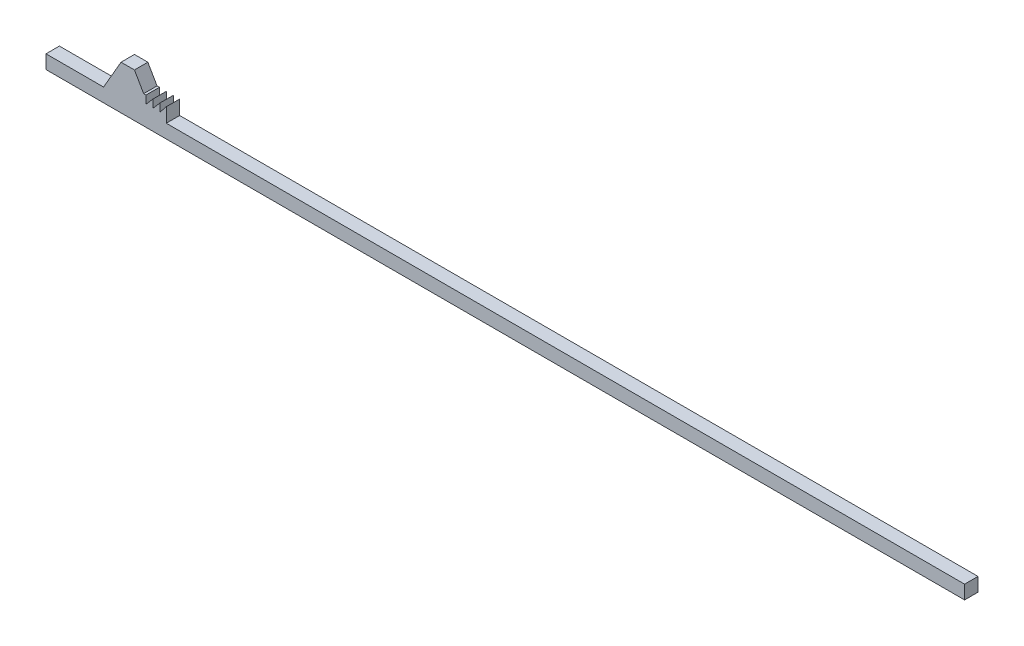
ISO-10303-21;
HEADER;
FILE_DESCRIPTION(('STEP AP214'),'2;1');
FILE_NAME('part.step','',(''),(''),'','','');
FILE_SCHEMA(('AUTOMOTIVE_DESIGN { 1 0 10303 214 1 1 1 1 }'));
ENDSEC;
DATA;
#1=APPLICATION_CONTEXT('core data for automotive mechanical design processes');
#2=APPLICATION_PROTOCOL_DEFINITION('international standard','automotive_design',2000,#1);
#3=PRODUCT_CONTEXT('',#1,'mechanical');
#4=PRODUCT('Part','Part','',(#3));
#5=PRODUCT_RELATED_PRODUCT_CATEGORY('part','',(#4));
#6=PRODUCT_DEFINITION_FORMATION('','',#4);
#7=PRODUCT_DEFINITION_CONTEXT('part definition',#1,'design');
#8=PRODUCT_DEFINITION('design','',#6,#7);
#9=PRODUCT_DEFINITION_SHAPE('','',#8);
#10=(LENGTH_UNIT() NAMED_UNIT(*) SI_UNIT(.MILLI.,.METRE.));
#11=(NAMED_UNIT(*) PLANE_ANGLE_UNIT() SI_UNIT($,.RADIAN.));
#12=(NAMED_UNIT(*) SI_UNIT($,.STERADIAN.) SOLID_ANGLE_UNIT());
#13=UNCERTAINTY_MEASURE_WITH_UNIT(LENGTH_MEASURE(1.E-05),#10,'distance_accuracy_value','');
#14=(GEOMETRIC_REPRESENTATION_CONTEXT(3) GLOBAL_UNCERTAINTY_ASSIGNED_CONTEXT((#13)) GLOBAL_UNIT_ASSIGNED_CONTEXT((#10,
#11,#12)) REPRESENTATION_CONTEXT('',''));
#15=CARTESIAN_POINT('',(0.,0.,0.));
#16=DIRECTION('',(0.,0.,1.));
#17=DIRECTION('',(1.,0.,0.));
#18=AXIS2_PLACEMENT_3D('',#15,#16,#17);
#19=CARTESIAN_POINT('',(609.24613818849,32.4844053294625,5.));
#20=DIRECTION('',(0.,-1.,0.));
#21=DIRECTION('',(0.,0.,-1.));
#22=AXIS2_PLACEMENT_3D('',#19,#20,#21);
#23=PLANE('',#22);
#24=DIRECTION('',(-1.,0.,0.));
#25=VECTOR('',#24,1.);
#26=CARTESIAN_POINT('',(609.24613818849,32.4844053294625,0.));
#27=LINE('',#26,#25);
#28=CARTESIAN_POINT('',(614.24613818849,32.4844053294625,0.));
#29=VERTEX_POINT('',#28);
#30=CARTESIAN_POINT('',(609.24613818849,32.4844053294625,0.));
#31=VERTEX_POINT('',#30);
#32=EDGE_CURVE('E177',#29,#31,#27,.T.);
#33=ORIENTED_EDGE('',*,*,#32,.T.);
#34=DIRECTION('',(0.,0.,-1.));
#35=VECTOR('',#34,1.);
#36=CARTESIAN_POINT('',(609.24613818849,32.4844053294625,5.));
#37=LINE('',#36,#35);
#38=CARTESIAN_POINT('',(609.24613818849,32.4844053294625,5.));
#39=VERTEX_POINT('',#38);
#40=EDGE_CURVE('E11',#39,#31,#37,.T.);
#41=ORIENTED_EDGE('',*,*,#40,.F.);
#42=DIRECTION('',(-1.,0.,0.));
#43=VECTOR('',#42,1.);
#44=CARTESIAN_POINT('',(609.24613818849,32.4844053294625,5.));
#45=LINE('',#44,#43);
#46=CARTESIAN_POINT('',(614.24613818849,32.4844053294625,5.));
#47=VERTEX_POINT('',#46);
#48=EDGE_CURVE('E207',#47,#39,#45,.T.);
#49=ORIENTED_EDGE('',*,*,#48,.F.);
#50=DIRECTION('',(0.,0.,-1.));
#51=VECTOR('',#50,1.);
#52=CARTESIAN_POINT('',(614.24613818849,32.4844053294625,5.));
#53=LINE('',#52,#51);
#54=EDGE_CURVE('E173',#47,#29,#53,.T.);
#55=ORIENTED_EDGE('',*,*,#54,.T.);
#56=EDGE_LOOP('',(#33,#41,#49,#55));
#57=FACE_BOUND('',#56,.T.);
#58=ADVANCED_FACE('F33',(#57),#23,.F.);
#59=CARTESIAN_POINT('',(609.24613818849,32.4844053294625,5.));
#60=DIRECTION('',(0.866025403784457,-0.499999999999969,0.));
#61=DIRECTION('',(0.499999999999969,0.866025403784457,0.));
#62=AXIS2_PLACEMENT_3D('',#59,#60,#61);
#63=PLANE('',#62);
#64=DIRECTION('',(-0.499999999999969,-0.866025403784457,0.));
#65=VECTOR('',#64,1.);
#66=CARTESIAN_POINT('',(609.24613818849,32.4844053294625,0.));
#67=LINE('',#66,#65);
#68=CARTESIAN_POINT('',(602.736749708744,21.2098137563378,0.));
#69=VERTEX_POINT('',#68);
#70=EDGE_CURVE('E180',#31,#69,#67,.T.);
#71=ORIENTED_EDGE('',*,*,#70,.T.);
#72=DIRECTION('',(0.,0.,-1.));
#73=VECTOR('',#72,1.);
#74=CARTESIAN_POINT('',(602.736749708744,21.2098137563378,5.));
#75=LINE('',#74,#73);
#76=CARTESIAN_POINT('',(602.736749708744,21.2098137563378,5.));
#77=VERTEX_POINT('',#76);
#78=EDGE_CURVE('E41',#77,#69,#75,.T.);
#79=ORIENTED_EDGE('',*,*,#78,.F.);
#80=DIRECTION('',(-0.499999999999969,-0.866025403784457,0.));
#81=VECTOR('',#80,1.);
#82=CARTESIAN_POINT('',(609.24613818849,32.4844053294625,5.));
#83=LINE('',#82,#81);
#84=EDGE_CURVE('E116',#39,#77,#83,.T.);
#85=ORIENTED_EDGE('',*,*,#84,.F.);
#86=ORIENTED_EDGE('',*,*,#40,.T.);
#87=EDGE_LOOP('',(#71,#79,#85,#86));
#88=FACE_BOUND('',#87,.T.);
#89=ADVANCED_FACE('F305',(#88),#63,.F.);
#90=CARTESIAN_POINT('',(581.281303194124,21.2098137563387,5.));
#91=DIRECTION('',(0.,-1.,0.));
#92=DIRECTION('',(1.,0.,0.));
#93=AXIS2_PLACEMENT_3D('',#90,#91,#92);
#94=PLANE('',#93);
#95=DIRECTION('',(-1.,0.,0.));
#96=VECTOR('',#95,1.);
#97=CARTESIAN_POINT('',(581.281303194124,21.2098137563387,0.));
#98=LINE('',#97,#96);
#99=CARTESIAN_POINT('',(581.281303194124,21.2098137563387,0.));
#100=VERTEX_POINT('',#99);
#101=EDGE_CURVE('E182',#69,#100,#98,.T.);
#102=ORIENTED_EDGE('',*,*,#101,.T.);
#103=DIRECTION('',(0.,0.,-1.));
#104=VECTOR('',#103,1.);
#105=CARTESIAN_POINT('',(581.281303194124,21.2098137563387,5.));
#106=LINE('',#105,#104);
#107=CARTESIAN_POINT('',(581.281303194124,21.2098137563387,5.));
#108=VERTEX_POINT('',#107);
#109=EDGE_CURVE('E238',#108,#100,#106,.T.);
#110=ORIENTED_EDGE('',*,*,#109,.F.);
#111=DIRECTION('',(-1.,0.,0.));
#112=VECTOR('',#111,1.);
#113=CARTESIAN_POINT('',(581.281303194124,21.2098137563387,5.));
#114=LINE('',#113,#112);
#115=EDGE_CURVE('E246',#77,#108,#114,.T.);
#116=ORIENTED_EDGE('',*,*,#115,.F.);
#117=ORIENTED_EDGE('',*,*,#78,.T.);
#118=EDGE_LOOP('',(#102,#110,#116,#117));
#119=FACE_BOUND('',#118,.T.);
#120=ADVANCED_FACE('F244',(#119),#94,.F.);
#121=CARTESIAN_POINT('',(581.281303194124,16.1098137563397,5.));
#122=DIRECTION('',(1.,0.,0.));
#123=DIRECTION('',(0.,0.,-1.));
#124=AXIS2_PLACEMENT_3D('',#121,#122,#123);
#125=PLANE('',#124);
#126=DIRECTION('',(0.,-1.,0.));
#127=VECTOR('',#126,1.);
#128=CARTESIAN_POINT('',(581.281303194124,16.1098137563397,0.));
#129=LINE('',#128,#127);
#130=CARTESIAN_POINT('',(581.281303194124,16.1098137563397,0.));
#131=VERTEX_POINT('',#130);
#132=EDGE_CURVE('E184',#100,#131,#129,.T.);
#133=ORIENTED_EDGE('',*,*,#132,.T.);
#134=DIRECTION('',(0.,0.,-1.));
#135=VECTOR('',#134,1.);
#136=CARTESIAN_POINT('',(581.281303194124,16.1098137563397,5.));
#137=LINE('',#136,#135);
#138=CARTESIAN_POINT('',(581.281303194124,16.1098137563397,5.));
#139=VERTEX_POINT('',#138);
#140=EDGE_CURVE('E235',#139,#131,#137,.T.);
#141=ORIENTED_EDGE('',*,*,#140,.F.);
#142=DIRECTION('',(0.,-1.,0.));
#143=VECTOR('',#142,1.);
#144=CARTESIAN_POINT('',(581.281303194124,16.1098137563397,5.));
#145=LINE('',#144,#143);
#146=EDGE_CURVE('E264',#108,#139,#145,.T.);
#147=ORIENTED_EDGE('',*,*,#146,.F.);
#148=ORIENTED_EDGE('',*,*,#109,.T.);
#149=EDGE_LOOP('',(#133,#141,#147,#148));
#150=FACE_BOUND('',#149,.T.);
#151=ADVANCED_FACE('F255',(#150),#125,.F.);
#152=CARTESIAN_POINT('',(581.281303194124,16.1098137563397,5.));
#153=DIRECTION('',(0.,1.,0.));
#154=DIRECTION('',(-1.,0.,0.));
#155=AXIS2_PLACEMENT_3D('',#152,#153,#154);
#156=PLANE('',#155);
#157=DIRECTION('',(1.,0.,0.));
#158=VECTOR('',#157,1.);
#159=CARTESIAN_POINT('',(581.281303194124,16.1098137563397,0.));
#160=LINE('',#159,#158);
#161=CARTESIAN_POINT('',(923.648003194124,16.1098137563348,0.));
#162=VERTEX_POINT('',#161);
#163=EDGE_CURVE('E186',#131,#162,#160,.T.);
#164=ORIENTED_EDGE('',*,*,#163,.T.);
#165=DIRECTION('',(0.,0.,-1.));
#166=VECTOR('',#165,1.);
#167=CARTESIAN_POINT('',(923.648003194124,16.1098137563348,5.));
#168=LINE('',#167,#166);
#169=CARTESIAN_POINT('',(923.648003194124,16.1098137563348,5.));
#170=VERTEX_POINT('',#169);
#171=EDGE_CURVE('E232',#170,#162,#168,.T.);
#172=ORIENTED_EDGE('',*,*,#171,.F.);
#173=DIRECTION('',(1.,0.,0.));
#174=VECTOR('',#173,1.);
#175=CARTESIAN_POINT('',(581.281303194124,16.1098137563397,5.));
#176=LINE('',#175,#174);
#177=EDGE_CURVE('E261',#139,#170,#176,.T.);
#178=ORIENTED_EDGE('',*,*,#177,.F.);
#179=ORIENTED_EDGE('',*,*,#140,.T.);
#180=EDGE_LOOP('',(#164,#172,#178,#179));
#181=FACE_BOUND('',#180,.T.);
#182=ADVANCED_FACE('F259',(#181),#156,.F.);
#183=CARTESIAN_POINT('',(923.648003194124,21.2098137563369,5.));
#184=DIRECTION('',(-1.,0.,0.));
#185=DIRECTION('',(0.,0.,1.));
#186=AXIS2_PLACEMENT_3D('',#183,#184,#185);
#187=PLANE('',#186);
#188=DIRECTION('',(0.,1.,0.));
#189=VECTOR('',#188,1.);
#190=CARTESIAN_POINT('',(923.648003194124,21.2098137563369,0.));
#191=LINE('',#190,#189);
#192=CARTESIAN_POINT('',(923.648003194124,21.2098137563369,0.));
#193=VERTEX_POINT('',#192);
#194=EDGE_CURVE('E188',#162,#193,#191,.T.);
#195=ORIENTED_EDGE('',*,*,#194,.T.);
#196=DIRECTION('',(0.,0.,-1.));
#197=VECTOR('',#196,1.);
#198=CARTESIAN_POINT('',(923.648003194124,21.2098137563369,5.));
#199=LINE('',#198,#197);
#200=CARTESIAN_POINT('',(923.648003194124,21.2098137563369,5.));
#201=VERTEX_POINT('',#200);
#202=EDGE_CURVE('E229',#201,#193,#199,.T.);
#203=ORIENTED_EDGE('',*,*,#202,.F.);
#204=DIRECTION('',(0.,1.,0.));
#205=VECTOR('',#204,1.);
#206=CARTESIAN_POINT('',(923.648003194124,21.2098137563369,5.));
#207=LINE('',#206,#205);
#208=EDGE_CURVE('E263',#170,#201,#207,.T.);
#209=ORIENTED_EDGE('',*,*,#208,.F.);
#210=ORIENTED_EDGE('',*,*,#171,.T.);
#211=EDGE_LOOP('',(#195,#203,#209,#210));
#212=FACE_BOUND('',#211,.T.);
#213=ADVANCED_FACE('F318',(#212),#187,.F.);
#214=CARTESIAN_POINT('',(626.111252728978,21.2098137563378,5.));
#215=DIRECTION('',(0.,-1.,0.));
#216=DIRECTION('',(1.,0.,0.));
#217=AXIS2_PLACEMENT_3D('',#214,#215,#216);
#218=PLANE('',#217);
#219=DIRECTION('',(-1.,0.,0.));
#220=VECTOR('',#219,1.);
#221=CARTESIAN_POINT('',(626.111252728978,21.2098137563378,0.));
#222=LINE('',#221,#220);
#223=CARTESIAN_POINT('',(626.111252728978,21.2098137563378,0.));
#224=VERTEX_POINT('',#223);
#225=EDGE_CURVE('E190',#193,#224,#222,.T.);
#226=ORIENTED_EDGE('',*,*,#225,.T.);
#227=DIRECTION('',(0.,0.,-1.));
#228=VECTOR('',#227,1.);
#229=CARTESIAN_POINT('',(626.111252728978,21.2098137563378,5.));
#230=LINE('',#229,#228);
#231=CARTESIAN_POINT('',(626.111252728978,21.2098137563378,5.));
#232=VERTEX_POINT('',#231);
#233=EDGE_CURVE('E226',#232,#224,#230,.T.);
#234=ORIENTED_EDGE('',*,*,#233,.F.);
#235=DIRECTION('',(-1.,0.,0.));
#236=VECTOR('',#235,1.);
#237=CARTESIAN_POINT('',(626.111252728978,21.2098137563378,5.));
#238=LINE('',#237,#236);
#239=EDGE_CURVE('E266',#201,#232,#238,.T.);
#240=ORIENTED_EDGE('',*,*,#239,.F.);
#241=ORIENTED_EDGE('',*,*,#202,.T.);
#242=EDGE_LOOP('',(#226,#234,#240,#241));
#243=FACE_BOUND('',#242,.T.);
#244=ADVANCED_FACE('F321',(#243),#218,.F.);
#245=CARTESIAN_POINT('',(626.111252728978,26.5427790499218,5.));
#246=DIRECTION('',(-1.,0.,0.));
#247=DIRECTION('',(0.,0.,1.));
#248=AXIS2_PLACEMENT_3D('',#245,#246,#247);
#249=PLANE('',#248);
#250=DIRECTION('',(0.,1.,0.));
#251=VECTOR('',#250,1.);
#252=CARTESIAN_POINT('',(626.111252728978,26.5427790499218,0.));
#253=LINE('',#252,#251);
#254=CARTESIAN_POINT('',(626.111252728978,26.5427790499218,0.));
#255=VERTEX_POINT('',#254);
#256=EDGE_CURVE('E192',#224,#255,#253,.T.);
#257=ORIENTED_EDGE('',*,*,#256,.T.);
#258=DIRECTION('',(0.,0.,-1.));
#259=VECTOR('',#258,1.);
#260=CARTESIAN_POINT('',(626.111252728978,26.5427790499218,5.));
#261=LINE('',#260,#259);
#262=CARTESIAN_POINT('',(626.111252728978,26.5427790499218,5.));
#263=VERTEX_POINT('',#262);
#264=EDGE_CURVE('E223',#263,#255,#261,.T.);
#265=ORIENTED_EDGE('',*,*,#264,.F.);
#266=DIRECTION('',(0.,1.,0.));
#267=VECTOR('',#266,1.);
#268=CARTESIAN_POINT('',(626.111252728978,26.5427790499218,5.));
#269=LINE('',#268,#267);
#270=EDGE_CURVE('E272',#232,#263,#269,.T.);
#271=ORIENTED_EDGE('',*,*,#270,.F.);
#272=ORIENTED_EDGE('',*,*,#233,.T.);
#273=EDGE_LOOP('',(#257,#265,#271,#272));
#274=FACE_BOUND('',#273,.T.);
#275=ADVANCED_FACE('F325',(#274),#249,.F.);
#276=CARTESIAN_POINT('',(623.726480528568,23.5680436068089,5.));
#277=DIRECTION('',(0.780230748095933,-0.625491790294374,0.));
#278=DIRECTION('',(0.625491790294374,0.780230748095933,0.));
#279=AXIS2_PLACEMENT_3D('',#276,#277,#278);
#280=PLANE('',#279);
#281=DIRECTION('',(-0.625491790294374,-0.780230748095933,0.));
#282=VECTOR('',#281,1.);
#283=CARTESIAN_POINT('',(623.726480528568,23.5680436068089,0.));
#284=LINE('',#283,#282);
#285=CARTESIAN_POINT('',(623.726480528568,23.5680436068089,0.));
#286=VERTEX_POINT('',#285);
#287=EDGE_CURVE('E194',#255,#286,#284,.T.);
#288=ORIENTED_EDGE('',*,*,#287,.T.);
#289=DIRECTION('',(0.,0.,-1.));
#290=VECTOR('',#289,1.);
#291=CARTESIAN_POINT('',(623.726480528568,23.5680436068089,5.));
#292=LINE('',#291,#290);
#293=CARTESIAN_POINT('',(623.726480528568,23.5680436068089,5.));
#294=VERTEX_POINT('',#293);
#295=EDGE_CURVE('E220',#294,#286,#292,.T.);
#296=ORIENTED_EDGE('',*,*,#295,.F.);
#297=DIRECTION('',(-0.625491790294374,-0.780230748095933,0.));
#298=VECTOR('',#297,1.);
#299=CARTESIAN_POINT('',(623.726480528568,23.5680436068089,5.));
#300=LINE('',#299,#298);
#301=EDGE_CURVE('E274',#263,#294,#300,.T.);
#302=ORIENTED_EDGE('',*,*,#301,.F.);
#303=ORIENTED_EDGE('',*,*,#264,.T.);
#304=EDGE_LOOP('',(#288,#296,#302,#303));
#305=FACE_BOUND('',#304,.T.);
#306=ADVANCED_FACE('F329',(#305),#280,.F.);
#307=CARTESIAN_POINT('',(623.726480528568,23.5680436068089,5.));
#308=DIRECTION('',(-1.,0.,0.));
#309=DIRECTION('',(0.,0.,1.));
#310=AXIS2_PLACEMENT_3D('',#307,#308,#309);
#311=PLANE('',#310);
#312=DIRECTION('',(0.,1.,0.));
#313=VECTOR('',#312,1.);
#314=CARTESIAN_POINT('',(623.726480528568,23.5680436068089,0.));
#315=LINE('',#314,#313);
#316=CARTESIAN_POINT('',(623.726480528568,26.5427790499218,0.));
#317=VERTEX_POINT('',#316);
#318=EDGE_CURVE('E196',#286,#317,#315,.T.);
#319=ORIENTED_EDGE('',*,*,#318,.T.);
#320=DIRECTION('',(0.,0.,-1.));
#321=VECTOR('',#320,1.);
#322=CARTESIAN_POINT('',(623.726480528568,26.5427790499218,5.));
#323=LINE('',#322,#321);
#324=CARTESIAN_POINT('',(623.726480528568,26.5427790499218,5.));
#325=VERTEX_POINT('',#324);
#326=EDGE_CURVE('E217',#325,#317,#323,.T.);
#327=ORIENTED_EDGE('',*,*,#326,.F.);
#328=DIRECTION('',(0.,1.,0.));
#329=VECTOR('',#328,1.);
#330=CARTESIAN_POINT('',(623.726480528568,23.5680436068089,5.));
#331=LINE('',#330,#329);
#332=EDGE_CURVE('E276',#294,#325,#331,.T.);
#333=ORIENTED_EDGE('',*,*,#332,.F.);
#334=ORIENTED_EDGE('',*,*,#295,.T.);
#335=EDGE_LOOP('',(#319,#327,#333,#334));
#336=FACE_BOUND('',#335,.T.);
#337=ADVANCED_FACE('F333',(#336),#311,.F.);
#338=CARTESIAN_POINT('',(623.726480528568,26.5427790499218,5.));
#339=DIRECTION('',(0.755037412687331,-0.655681710468137,0.));
#340=DIRECTION('',(0.655681710468137,0.755037412687331,0.));
#341=AXIS2_PLACEMENT_3D('',#338,#339,#340);
#342=PLANE('',#341);
#343=DIRECTION('',(-0.655681710468137,-0.755037412687331,0.));
#344=VECTOR('',#343,1.);
#345=CARTESIAN_POINT('',(623.726480528568,26.5427790499218,0.));
#346=LINE('',#345,#344);
#347=CARTESIAN_POINT('',(621.143191818957,23.5680436068107,0.));
#348=VERTEX_POINT('',#347);
#349=EDGE_CURVE('E198',#317,#348,#346,.T.);
#350=ORIENTED_EDGE('',*,*,#349,.T.);
#351=DIRECTION('',(0.,0.,-1.));
#352=VECTOR('',#351,1.);
#353=CARTESIAN_POINT('',(621.143191818957,23.5680436068107,5.));
#354=LINE('',#353,#352);
#355=CARTESIAN_POINT('',(621.143191818957,23.5680436068107,5.));
#356=VERTEX_POINT('',#355);
#357=EDGE_CURVE('E214',#356,#348,#354,.T.);
#358=ORIENTED_EDGE('',*,*,#357,.F.);
#359=DIRECTION('',(-0.655681710468137,-0.755037412687331,0.));
#360=VECTOR('',#359,1.);
#361=CARTESIAN_POINT('',(623.726480528568,26.5427790499218,5.));
#362=LINE('',#361,#360);
#363=EDGE_CURVE('E278',#325,#356,#362,.T.);
#364=ORIENTED_EDGE('',*,*,#363,.F.);
#365=ORIENTED_EDGE('',*,*,#326,.T.);
#366=EDGE_LOOP('',(#350,#358,#364,#365));
#367=FACE_BOUND('',#366,.T.);
#368=ADVANCED_FACE('F337',(#367),#342,.F.);
#369=CARTESIAN_POINT('',(621.143191818957,23.5680436068107,5.));
#370=DIRECTION('',(-1.,0.,0.));
#371=DIRECTION('',(0.,0.,1.));
#372=AXIS2_PLACEMENT_3D('',#369,#370,#371);
#373=PLANE('',#372);
#374=DIRECTION('',(0.,1.,0.));
#375=VECTOR('',#374,1.);
#376=CARTESIAN_POINT('',(621.143191818957,23.5680436068107,0.));
#377=LINE('',#376,#375);
#378=CARTESIAN_POINT('',(621.143191818957,26.5427790499218,0.));
#379=VERTEX_POINT('',#378);
#380=EDGE_CURVE('E200',#348,#379,#377,.T.);
#381=ORIENTED_EDGE('',*,*,#380,.T.);
#382=DIRECTION('',(0.,0.,-1.));
#383=VECTOR('',#382,1.);
#384=CARTESIAN_POINT('',(621.143191818957,26.5427790499218,5.));
#385=LINE('',#384,#383);
#386=CARTESIAN_POINT('',(621.143191818957,26.5427790499218,5.));
#387=VERTEX_POINT('',#386);
#388=EDGE_CURVE('E211',#387,#379,#385,.T.);
#389=ORIENTED_EDGE('',*,*,#388,.F.);
#390=DIRECTION('',(0.,1.,0.));
#391=VECTOR('',#390,1.);
#392=CARTESIAN_POINT('',(621.143191818957,23.5680436068107,5.));
#393=LINE('',#392,#391);
#394=EDGE_CURVE('E280',#356,#387,#393,.T.);
#395=ORIENTED_EDGE('',*,*,#394,.F.);
#396=ORIENTED_EDGE('',*,*,#357,.T.);
#397=EDGE_LOOP('',(#381,#389,#395,#396));
#398=FACE_BOUND('',#397,.T.);
#399=ADVANCED_FACE('F286',(#398),#373,.F.);
#400=CARTESIAN_POINT('',(621.143191818957,26.5427790499218,5.));
#401=DIRECTION('',(0.75503741268687,-0.655681710468667,0.));
#402=DIRECTION('',(0.655681710468667,0.75503741268687,0.));
#403=AXIS2_PLACEMENT_3D('',#400,#401,#402);
#404=PLANE('',#403);
#405=DIRECTION('',(-0.655681710468667,-0.75503741268687,0.));
#406=VECTOR('',#405,1.);
#407=CARTESIAN_POINT('',(621.143191818957,26.5427790499218,0.));
#408=LINE('',#407,#406);
#409=CARTESIAN_POINT('',(618.559903109342,23.5680436068107,0.));
#410=VERTEX_POINT('',#409);
#411=EDGE_CURVE('E202',#379,#410,#408,.T.);
#412=ORIENTED_EDGE('',*,*,#411,.T.);
#413=DIRECTION('',(0.,0.,-1.));
#414=VECTOR('',#413,1.);
#415=CARTESIAN_POINT('',(618.559903109342,23.5680436068107,5.));
#416=LINE('',#415,#414);
#417=CARTESIAN_POINT('',(618.559903109342,23.5680436068107,5.));
#418=VERTEX_POINT('',#417);
#419=EDGE_CURVE('E168',#418,#410,#416,.T.);
#420=ORIENTED_EDGE('',*,*,#419,.F.);
#421=DIRECTION('',(-0.655681710468667,-0.75503741268687,0.));
#422=VECTOR('',#421,1.);
#423=CARTESIAN_POINT('',(621.143191818957,26.5427790499218,5.));
#424=LINE('',#423,#422);
#425=EDGE_CURVE('E159',#387,#418,#424,.T.);
#426=ORIENTED_EDGE('',*,*,#425,.F.);
#427=ORIENTED_EDGE('',*,*,#388,.T.);
#428=EDGE_LOOP('',(#412,#420,#426,#427));
#429=FACE_BOUND('',#428,.T.);
#430=ADVANCED_FACE('F290',(#429),#404,.F.);
#431=CARTESIAN_POINT('',(618.559903109342,23.5680436068107,5.));
#432=DIRECTION('',(-1.,0.,0.));
#433=DIRECTION('',(0.,0.,1.));
#434=AXIS2_PLACEMENT_3D('',#431,#432,#433);
#435=PLANE('',#434);
#436=DIRECTION('',(0.,1.,0.));
#437=VECTOR('',#436,1.);
#438=CARTESIAN_POINT('',(618.559903109342,23.5680436068107,0.));
#439=LINE('',#438,#437);
#440=CARTESIAN_POINT('',(618.559903109342,26.5427790499218,0.));
#441=VERTEX_POINT('',#440);
#442=EDGE_CURVE('E167',#410,#441,#439,.T.);
#443=ORIENTED_EDGE('',*,*,#442,.T.);
#444=DIRECTION('',(0.,0.,-1.));
#445=VECTOR('',#444,1.);
#446=CARTESIAN_POINT('',(618.559903109342,26.5427790499218,5.));
#447=LINE('',#446,#445);
#448=CARTESIAN_POINT('',(618.559903109342,26.5427790499218,5.));
#449=VERTEX_POINT('',#448);
#450=EDGE_CURVE('E164',#449,#441,#447,.T.);
#451=ORIENTED_EDGE('',*,*,#450,.F.);
#452=DIRECTION('',(0.,1.,0.));
#453=VECTOR('',#452,1.);
#454=CARTESIAN_POINT('',(618.559903109342,23.5680436068107,5.));
#455=LINE('',#454,#453);
#456=EDGE_CURVE('E153',#418,#449,#455,.T.);
#457=ORIENTED_EDGE('',*,*,#456,.F.);
#458=ORIENTED_EDGE('',*,*,#419,.T.);
#459=EDGE_LOOP('',(#443,#451,#457,#458));
#460=FACE_BOUND('',#459,.T.);
#461=ADVANCED_FACE('F165',(#460),#435,.F.);
#462=CARTESIAN_POINT('',(618.559903109342,26.5427790499218,5.));
#463=DIRECTION('',(0.,-1.,0.));
#464=DIRECTION('',(0.,0.,-1.));
#465=AXIS2_PLACEMENT_3D('',#462,#463,#464);
#466=PLANE('',#465);
#467=DIRECTION('',(-1.,0.,0.));
#468=VECTOR('',#467,1.);
#469=CARTESIAN_POINT('',(618.559903109342,26.5427790499218,0.));
#470=LINE('',#469,#468);
#471=CARTESIAN_POINT('',(617.676537720407,26.5427790499218,0.));
#472=VERTEX_POINT('',#471);
#473=EDGE_CURVE('E102',#441,#472,#470,.T.);
#474=ORIENTED_EDGE('',*,*,#473,.T.);
#475=DIRECTION('',(0.,0.,-1.));
#476=VECTOR('',#475,1.);
#477=CARTESIAN_POINT('',(617.676537720407,26.5427790499218,5.));
#478=LINE('',#477,#476);
#479=CARTESIAN_POINT('',(617.676537720407,26.5427790499218,5.));
#480=VERTEX_POINT('',#479);
#481=EDGE_CURVE('E169',#480,#472,#478,.T.);
#482=ORIENTED_EDGE('',*,*,#481,.F.);
#483=DIRECTION('',(-1.,0.,0.));
#484=VECTOR('',#483,1.);
#485=CARTESIAN_POINT('',(618.559903109342,26.5427790499218,5.));
#486=LINE('',#485,#484);
#487=EDGE_CURVE('E157',#449,#480,#486,.T.);
#488=ORIENTED_EDGE('',*,*,#487,.F.);
#489=ORIENTED_EDGE('',*,*,#450,.T.);
#490=EDGE_LOOP('',(#474,#482,#488,#489));
#491=FACE_BOUND('',#490,.T.);
#492=ADVANCED_FACE('F171',(#491),#466,.F.);
#493=CARTESIAN_POINT('',(614.24613818849,32.4844053294625,5.));
#494=DIRECTION('',(-0.866025403784471,-0.499999999999943,0.));
#495=DIRECTION('',(0.499999999999943,-0.866025403784471,0.));
#496=AXIS2_PLACEMENT_3D('',#493,#494,#495);
#497=PLANE('',#496);
#498=DIRECTION('',(-0.499999999999943,0.866025403784471,0.));
#499=VECTOR('',#498,1.);
#500=CARTESIAN_POINT('',(614.24613818849,32.4844053294625,0.));
#501=LINE('',#500,#499);
#502=EDGE_CURVE('E108',#472,#29,#501,.T.);
#503=ORIENTED_EDGE('',*,*,#502,.T.);
#504=ORIENTED_EDGE('',*,*,#54,.F.);
#505=DIRECTION('',(-0.499999999999943,0.866025403784471,0.));
#506=VECTOR('',#505,1.);
#507=CARTESIAN_POINT('',(614.24613818849,32.4844053294625,5.));
#508=LINE('',#507,#506);
#509=EDGE_CURVE('E49',#480,#47,#508,.T.);
#510=ORIENTED_EDGE('',*,*,#509,.F.);
#511=ORIENTED_EDGE('',*,*,#481,.T.);
#512=EDGE_LOOP('',(#503,#504,#510,#511));
#513=FACE_BOUND('',#512,.T.);
#514=ADVANCED_FACE('F294',(#513),#497,.F.);
#515=CARTESIAN_POINT('',(0.,0.,5.));
#516=DIRECTION('',(0.,0.,1.));
#517=DIRECTION('',(1.,0.,0.));
#518=AXIS2_PLACEMENT_3D('',#515,#516,#517);
#519=PLANE('',#518);
#520=ORIENTED_EDGE('',*,*,#48,.T.);
#521=ORIENTED_EDGE('',*,*,#84,.T.);
#522=ORIENTED_EDGE('',*,*,#115,.T.);
#523=ORIENTED_EDGE('',*,*,#146,.T.);
#524=ORIENTED_EDGE('',*,*,#177,.T.);
#525=ORIENTED_EDGE('',*,*,#208,.T.);
#526=ORIENTED_EDGE('',*,*,#239,.T.);
#527=ORIENTED_EDGE('',*,*,#270,.T.);
#528=ORIENTED_EDGE('',*,*,#301,.T.);
#529=ORIENTED_EDGE('',*,*,#332,.T.);
#530=ORIENTED_EDGE('',*,*,#363,.T.);
#531=ORIENTED_EDGE('',*,*,#394,.T.);
#532=ORIENTED_EDGE('',*,*,#425,.T.);
#533=ORIENTED_EDGE('',*,*,#456,.T.);
#534=ORIENTED_EDGE('',*,*,#487,.T.);
#535=ORIENTED_EDGE('',*,*,#509,.T.);
#536=EDGE_LOOP('',(#520,#521,#522,#523,#524,#525,#526,#527,#528,#529,#530,#531,#532,#533,#534,#535));
#537=FACE_BOUND('',#536,.T.);
#538=ADVANCED_FACE('F155',(#537),#519,.T.);
#539=CARTESIAN_POINT('',(0.,0.,0.));
#540=DIRECTION('',(0.,0.,1.));
#541=DIRECTION('',(1.,0.,0.));
#542=AXIS2_PLACEMENT_3D('',#539,#540,#541);
#543=PLANE('',#542);
#544=ORIENTED_EDGE('',*,*,#32,.F.);
#545=ORIENTED_EDGE('',*,*,#502,.F.);
#546=ORIENTED_EDGE('',*,*,#473,.F.);
#547=ORIENTED_EDGE('',*,*,#442,.F.);
#548=ORIENTED_EDGE('',*,*,#411,.F.);
#549=ORIENTED_EDGE('',*,*,#380,.F.);
#550=ORIENTED_EDGE('',*,*,#349,.F.);
#551=ORIENTED_EDGE('',*,*,#318,.F.);
#552=ORIENTED_EDGE('',*,*,#287,.F.);
#553=ORIENTED_EDGE('',*,*,#256,.F.);
#554=ORIENTED_EDGE('',*,*,#225,.F.);
#555=ORIENTED_EDGE('',*,*,#194,.F.);
#556=ORIENTED_EDGE('',*,*,#163,.F.);
#557=ORIENTED_EDGE('',*,*,#132,.F.);
#558=ORIENTED_EDGE('',*,*,#101,.F.);
#559=ORIENTED_EDGE('',*,*,#70,.F.);
#560=EDGE_LOOP('',(#544,#545,#546,#547,#548,#549,#550,#551,#552,#553,#554,#555,#556,#557,#558,#559));
#561=FACE_BOUND('',#560,.T.);
#562=ADVANCED_FACE('F250',(#561),#543,.F.);
#563=CLOSED_SHELL('',(#58,#89,#120,#151,#182,#213,#244,#275,#306,#337,#368,#399,#430,#461,#492,
#514,#538,#562));
#564=MANIFOLD_SOLID_BREP('B2',#563);
#565=ADVANCED_BREP_SHAPE_REPRESENTATION('',(#18,#564),#14);
#566=SHAPE_DEFINITION_REPRESENTATION(#9,#565);
ENDSEC;
END-ISO-10303-21;
